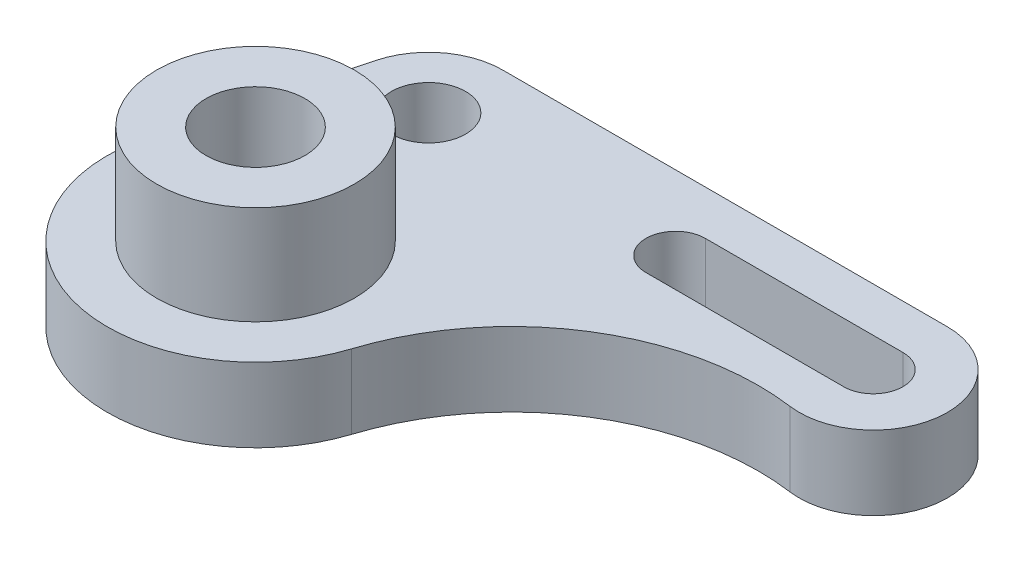
ISO-10303-21;
HEADER;
FILE_DESCRIPTION(('STEP AP214'),'2;1');
FILE_NAME('part.step','',(''),(''),'','','');
FILE_SCHEMA(('AUTOMOTIVE_DESIGN { 1 0 10303 214 1 1 1 1 }'));
ENDSEC;
DATA;
#1=APPLICATION_CONTEXT('core data for automotive mechanical design processes');
#2=APPLICATION_PROTOCOL_DEFINITION('international standard','automotive_design',2000,#1);
#3=PRODUCT_CONTEXT('',#1,'mechanical');
#4=PRODUCT('Part','Part','',(#3));
#5=PRODUCT_RELATED_PRODUCT_CATEGORY('part','',(#4));
#6=PRODUCT_DEFINITION_FORMATION('','',#4);
#7=PRODUCT_DEFINITION_CONTEXT('part definition',#1,'design');
#8=PRODUCT_DEFINITION('design','',#6,#7);
#9=PRODUCT_DEFINITION_SHAPE('','',#8);
#10=(LENGTH_UNIT() NAMED_UNIT(*) SI_UNIT(.MILLI.,.METRE.));
#11=(NAMED_UNIT(*) PLANE_ANGLE_UNIT() SI_UNIT($,.RADIAN.));
#12=(NAMED_UNIT(*) SI_UNIT($,.STERADIAN.) SOLID_ANGLE_UNIT());
#13=UNCERTAINTY_MEASURE_WITH_UNIT(LENGTH_MEASURE(1.E-05),#10,'distance_accuracy_value','');
#14=(GEOMETRIC_REPRESENTATION_CONTEXT(3) GLOBAL_UNCERTAINTY_ASSIGNED_CONTEXT((#13)) GLOBAL_UNIT_ASSIGNED_CONTEXT((#10,
#11,#12)) REPRESENTATION_CONTEXT('',''));
#15=CARTESIAN_POINT('',(0.,0.,0.));
#16=DIRECTION('',(0.,0.,1.));
#17=DIRECTION('',(1.,0.,0.));
#18=AXIS2_PLACEMENT_3D('',#15,#16,#17);
#19=CARTESIAN_POINT('',(-61.517336091964,15.,-16.1622196596945));
#20=DIRECTION('',(0.967177202898201,0.,0.254102849637724));
#21=DIRECTION('',(0.254102849637724,0.,-0.967177202898201));
#22=AXIS2_PLACEMENT_3D('',#19,#20,#21);
#23=PLANE('',#22);
#24=DIRECTION('',(-0.254102849637724,0.,0.967177202898201));
#25=VECTOR('',#24,1.);
#26=CARTESIAN_POINT('',(-61.517336091964,0.,-16.1622196596945));
#27=LINE('',#26,#25);
#28=CARTESIAN_POINT('',(-59.507658043473,0.,-23.8115427445659));
#29=VERTEX_POINT('',#28);
#30=CARTESIAN_POINT('',(-69.015316086946,0.,12.3769145108683));
#31=VERTEX_POINT('',#30);
#32=EDGE_CURVE('E173',#29,#31,#27,.T.);
#33=ORIENTED_EDGE('',*,*,#32,.T.);
#34=DIRECTION('',(0.,-1.,0.));
#35=VECTOR('',#34,1.);
#36=CARTESIAN_POINT('',(-69.015316086946,15.,12.3769145108683));
#37=LINE('',#36,#35);
#38=CARTESIAN_POINT('',(-69.015316086946,15.,12.3769145108683));
#39=VERTEX_POINT('',#38);
#40=EDGE_CURVE('E42',#39,#31,#37,.T.);
#41=ORIENTED_EDGE('',*,*,#40,.F.);
#42=DIRECTION('',(-0.254102849637724,0.,0.967177202898201));
#43=VECTOR('',#42,1.);
#44=CARTESIAN_POINT('',(-61.517336091964,15.,-16.1622196596945));
#45=LINE('',#44,#43);
#46=CARTESIAN_POINT('',(-59.507658043473,15.,-23.8115427445659));
#47=VERTEX_POINT('',#46);
#48=EDGE_CURVE('E176',#47,#39,#45,.T.);
#49=ORIENTED_EDGE('',*,*,#48,.F.);
#50=DIRECTION('',(0.,-1.,0.));
#51=VECTOR('',#50,1.);
#52=CARTESIAN_POINT('',(-59.507658043473,15.,-23.8115427445659));
#53=LINE('',#52,#51);
#54=EDGE_CURVE('E197',#47,#29,#53,.T.);
#55=ORIENTED_EDGE('',*,*,#54,.T.);
#56=EDGE_LOOP('',(#33,#41,#49,#55));
#57=FACE_BOUND('',#56,.T.);
#58=ADVANCED_FACE('F39',(#57),#23,.F.);
#59=CARTESIAN_POINT('',(-40.,15.,20.));
#60=DIRECTION('',(0.,-1.,0.));
#61=DIRECTION('',(0.,0.,-1.));
#62=AXIS2_PLACEMENT_3D('',#59,#60,#61);
#63=CYLINDRICAL_SURFACE('',#62,30.);
#64=CARTESIAN_POINT('',(-40.,0.,20.));
#65=DIRECTION('',(0.,1.,0.));
#66=DIRECTION('',(0.,0.,1.));
#67=AXIS2_PLACEMENT_3D('',#64,#65,#66);
#68=CIRCLE('',#67,30.);
#69=CARTESIAN_POINT('',(-11.429422304384,0.,29.149977603184));
#70=VERTEX_POINT('',#69);
#71=EDGE_CURVE('E201',#31,#70,#68,.T.);
#72=ORIENTED_EDGE('',*,*,#71,.T.);
#73=DIRECTION('',(0.,-1.,0.));
#74=VECTOR('',#73,1.);
#75=CARTESIAN_POINT('',(-11.429422304384,15.,29.149977603184));
#76=LINE('',#75,#74);
#77=CARTESIAN_POINT('',(-11.429422304384,15.,29.149977603184));
#78=VERTEX_POINT('',#77);
#79=EDGE_CURVE('E230',#78,#70,#76,.T.);
#80=ORIENTED_EDGE('',*,*,#79,.F.);
#81=CARTESIAN_POINT('',(-40.,15.,20.));
#82=DIRECTION('',(0.,1.,0.));
#83=DIRECTION('',(0.,0.,1.));
#84=AXIS2_PLACEMENT_3D('',#81,#82,#83);
#85=CIRCLE('',#84,30.);
#86=EDGE_CURVE('E180',#39,#78,#85,.T.);
#87=ORIENTED_EDGE('',*,*,#86,.F.);
#88=ORIENTED_EDGE('',*,*,#40,.T.);
#89=EDGE_LOOP('',(#72,#80,#87,#88));
#90=FACE_BOUND('',#89,.T.);
#91=ADVANCED_FACE('F241',(#90),#63,.T.);
#92=CARTESIAN_POINT('',(36.1882071883094,15.,44.3999402751574));
#93=DIRECTION('',(0.,-1.,0.));
#94=DIRECTION('',(0.,0.,-1.));
#95=AXIS2_PLACEMENT_3D('',#92,#93,#94);
#96=CYLINDRICAL_SURFACE('',#95,50.);
#97=CARTESIAN_POINT('',(36.1882071883094,0.,44.3999402751574));
#98=DIRECTION('',(0.,1.,0.));
#99=DIRECTION('',(0.,0.,1.));
#100=AXIS2_PLACEMENT_3D('',#97,#98,#99);
#101=CIRCLE('',#100,50.);
#102=CARTESIAN_POINT('',(42.9665093511483,0.,-5.13847532111752));
#103=VERTEX_POINT('',#102);
#104=EDGE_CURVE('E205',#103,#70,#101,.T.);
#105=ORIENTED_EDGE('',*,*,#104,.F.);
#106=DIRECTION('',(0.,-1.,0.));
#107=VECTOR('',#106,1.);
#108=CARTESIAN_POINT('',(42.9665093511483,15.,-5.13847532111752));
#109=LINE('',#108,#107);
#110=CARTESIAN_POINT('',(42.9665093511483,15.,-5.13847532111752));
#111=VERTEX_POINT('',#110);
#112=EDGE_CURVE('E228',#111,#103,#109,.T.);
#113=ORIENTED_EDGE('',*,*,#112,.F.);
#114=CARTESIAN_POINT('',(36.1882071883094,15.,44.3999402751574));
#115=DIRECTION('',(0.,1.,0.));
#116=DIRECTION('',(0.,0.,1.));
#117=AXIS2_PLACEMENT_3D('',#114,#115,#116);
#118=CIRCLE('',#117,50.);
#119=EDGE_CURVE('E184',#111,#78,#118,.T.);
#120=ORIENTED_EDGE('',*,*,#119,.T.);
#121=ORIENTED_EDGE('',*,*,#79,.T.);
#122=EDGE_LOOP('',(#105,#113,#120,#121));
#123=FACE_BOUND('',#122,.T.);
#124=ADVANCED_FACE('F249',(#123),#96,.F.);
#125=CARTESIAN_POINT('',(45.,15.,-20.));
#126=DIRECTION('',(0.,-1.,0.));
#127=DIRECTION('',(0.,0.,-1.));
#128=AXIS2_PLACEMENT_3D('',#125,#126,#127);
#129=CYLINDRICAL_SURFACE('',#128,15.);
#130=CARTESIAN_POINT('',(45.,0.,-20.));
#131=DIRECTION('',(0.,1.,0.));
#132=DIRECTION('',(0.,0.,1.));
#133=AXIS2_PLACEMENT_3D('',#130,#131,#132);
#134=CIRCLE('',#133,15.);
#135=CARTESIAN_POINT('',(45.,0.,-35.));
#136=VERTEX_POINT('',#135);
#137=EDGE_CURVE('E209',#103,#136,#134,.T.);
#138=ORIENTED_EDGE('',*,*,#137,.T.);
#139=DIRECTION('',(0.,-1.,0.));
#140=VECTOR('',#139,1.);
#141=CARTESIAN_POINT('',(45.,15.,-35.));
#142=LINE('',#141,#140);
#143=CARTESIAN_POINT('',(45.,15.,-35.));
#144=VERTEX_POINT('',#143);
#145=EDGE_CURVE('E224',#144,#136,#142,.T.);
#146=ORIENTED_EDGE('',*,*,#145,.F.);
#147=CARTESIAN_POINT('',(45.,15.,-20.));
#148=DIRECTION('',(0.,1.,0.));
#149=DIRECTION('',(0.,0.,1.));
#150=AXIS2_PLACEMENT_3D('',#147,#148,#149);
#151=CIRCLE('',#150,15.);
#152=EDGE_CURVE('E188',#111,#144,#151,.T.);
#153=ORIENTED_EDGE('',*,*,#152,.F.);
#154=ORIENTED_EDGE('',*,*,#112,.T.);
#155=EDGE_LOOP('',(#138,#146,#153,#154));
#156=FACE_BOUND('',#155,.T.);
#157=ADVANCED_FACE('F254',(#156),#129,.T.);
#158=CARTESIAN_POINT('',(0.,15.,-35.));
#159=DIRECTION('',(0.,0.,1.));
#160=DIRECTION('',(1.,0.,0.));
#161=AXIS2_PLACEMENT_3D('',#158,#159,#160);
#162=PLANE('',#161);
#163=DIRECTION('',(-1.,0.,0.));
#164=VECTOR('',#163,1.);
#165=CARTESIAN_POINT('',(0.,0.,-35.));
#166=LINE('',#165,#164);
#167=CARTESIAN_POINT('',(-45.,0.,-35.));
#168=VERTEX_POINT('',#167);
#169=EDGE_CURVE('E212',#136,#168,#166,.T.);
#170=ORIENTED_EDGE('',*,*,#169,.T.);
#171=DIRECTION('',(0.,-1.,0.));
#172=VECTOR('',#171,1.);
#173=CARTESIAN_POINT('',(-45.,15.,-35.));
#174=LINE('',#173,#172);
#175=CARTESIAN_POINT('',(-45.,15.,-35.));
#176=VERTEX_POINT('',#175);
#177=EDGE_CURVE('E220',#176,#168,#174,.T.);
#178=ORIENTED_EDGE('',*,*,#177,.F.);
#179=DIRECTION('',(-1.,0.,0.));
#180=VECTOR('',#179,1.);
#181=CARTESIAN_POINT('',(0.,15.,-35.));
#182=LINE('',#181,#180);
#183=EDGE_CURVE('E191',#144,#176,#182,.T.);
#184=ORIENTED_EDGE('',*,*,#183,.F.);
#185=ORIENTED_EDGE('',*,*,#145,.T.);
#186=EDGE_LOOP('',(#170,#178,#184,#185));
#187=FACE_BOUND('',#186,.T.);
#188=ADVANCED_FACE('F263',(#187),#162,.F.);
#189=CARTESIAN_POINT('',(-45.,15.,-20.));
#190=DIRECTION('',(0.,-1.,0.));
#191=DIRECTION('',(0.,0.,-1.));
#192=AXIS2_PLACEMENT_3D('',#189,#190,#191);
#193=CYLINDRICAL_SURFACE('',#192,15.);
#194=CARTESIAN_POINT('',(-45.,0.,-20.));
#195=DIRECTION('',(0.,1.,0.));
#196=DIRECTION('',(0.,0.,1.));
#197=AXIS2_PLACEMENT_3D('',#194,#195,#196);
#198=CIRCLE('',#197,15.);
#199=EDGE_CURVE('E181',#168,#29,#198,.T.);
#200=ORIENTED_EDGE('',*,*,#199,.T.);
#201=ORIENTED_EDGE('',*,*,#54,.F.);
#202=CARTESIAN_POINT('',(-45.,15.,-20.));
#203=DIRECTION('',(0.,1.,0.));
#204=DIRECTION('',(0.,0.,1.));
#205=AXIS2_PLACEMENT_3D('',#202,#203,#204);
#206=CIRCLE('',#205,15.);
#207=EDGE_CURVE('E194',#176,#47,#206,.T.);
#208=ORIENTED_EDGE('',*,*,#207,.F.);
#209=ORIENTED_EDGE('',*,*,#177,.T.);
#210=EDGE_LOOP('',(#200,#201,#208,#209));
#211=FACE_BOUND('',#210,.T.);
#212=ADVANCED_FACE('F261',(#211),#193,.T.);
#213=CARTESIAN_POINT('',(0.,15.,0.));
#214=DIRECTION('',(0.,1.,0.));
#215=DIRECTION('',(0.,0.,1.));
#216=AXIS2_PLACEMENT_3D('',#213,#214,#215);
#217=PLANE('',#216);
#218=CARTESIAN_POINT('',(-45.,15.,-20.));
#219=DIRECTION('',(0.,1.,0.));
#220=DIRECTION('',(0.,0.,1.));
#221=AXIS2_PLACEMENT_3D('',#218,#219,#220);
#222=CIRCLE('',#221,7.5);
#223=CARTESIAN_POINT('',(-45.,15.,-12.5));
#224=VERTEX_POINT('',#223);
#225=EDGE_CURVE('E146',#224,#224,#222,.T.);
#226=ORIENTED_EDGE('',*,*,#225,.F.);
#227=EDGE_LOOP('',(#226));
#228=FACE_BOUND('',#227,.T.);
#229=CARTESIAN_POINT('',(5.,15.,-20.));
#230=DIRECTION('',(0.,1.,0.));
#231=DIRECTION('',(0.,0.,1.));
#232=AXIS2_PLACEMENT_3D('',#229,#230,#231);
#233=CIRCLE('',#232,6.);
#234=CARTESIAN_POINT('',(5.,15.,-26.));
#235=VERTEX_POINT('',#234);
#236=CARTESIAN_POINT('',(5.,15.,-14.));
#237=VERTEX_POINT('',#236);
#238=EDGE_CURVE('E55',#235,#237,#233,.T.);
#239=ORIENTED_EDGE('',*,*,#238,.F.);
#240=DIRECTION('',(-1.,0.,0.));
#241=VECTOR('',#240,1.);
#242=CARTESIAN_POINT('',(5.,15.,-26.));
#243=LINE('',#242,#241);
#244=CARTESIAN_POINT('',(45.,15.,-26.));
#245=VERTEX_POINT('',#244);
#246=EDGE_CURVE('E138',#245,#235,#243,.T.);
#247=ORIENTED_EDGE('',*,*,#246,.F.);
#248=CARTESIAN_POINT('',(45.,15.,-20.));
#249=DIRECTION('',(0.,1.,0.));
#250=DIRECTION('',(0.,0.,1.));
#251=AXIS2_PLACEMENT_3D('',#248,#249,#250);
#252=CIRCLE('',#251,6.);
#253=CARTESIAN_POINT('',(45.,15.,-14.));
#254=VERTEX_POINT('',#253);
#255=EDGE_CURVE('E143',#254,#245,#252,.T.);
#256=ORIENTED_EDGE('',*,*,#255,.F.);
#257=DIRECTION('',(1.,0.,0.));
#258=VECTOR('',#257,1.);
#259=CARTESIAN_POINT('',(45.,15.,-14.));
#260=LINE('',#259,#258);
#261=EDGE_CURVE('E155',#237,#254,#260,.T.);
#262=ORIENTED_EDGE('',*,*,#261,.F.);
#263=EDGE_LOOP('',(#239,#247,#256,#262));
#264=FACE_BOUND('',#263,.T.);
#265=CARTESIAN_POINT('',(-40.,15.,20.));
#266=DIRECTION('',(0.,1.,0.));
#267=DIRECTION('',(0.,0.,1.));
#268=AXIS2_PLACEMENT_3D('',#265,#266,#267);
#269=CIRCLE('',#268,20.);
#270=CARTESIAN_POINT('',(-40.,15.,40.));
#271=VERTEX_POINT('',#270);
#272=EDGE_CURVE('E11',#271,#271,#269,.T.);
#273=ORIENTED_EDGE('',*,*,#272,.F.);
#274=EDGE_LOOP('',(#273));
#275=FACE_BOUND('',#274,.T.);
#276=ORIENTED_EDGE('',*,*,#48,.T.);
#277=ORIENTED_EDGE('',*,*,#86,.T.);
#278=ORIENTED_EDGE('',*,*,#119,.F.);
#279=ORIENTED_EDGE('',*,*,#152,.T.);
#280=ORIENTED_EDGE('',*,*,#183,.T.);
#281=ORIENTED_EDGE('',*,*,#207,.T.);
#282=EDGE_LOOP('',(#276,#277,#278,#279,#280,#281));
#283=FACE_BOUND('',#282,.T.);
#284=ADVANCED_FACE('F257',(#228,#264,#275,#283),#217,.T.);
#285=CARTESIAN_POINT('',(0.,0.,0.));
#286=DIRECTION('',(0.,1.,0.));
#287=DIRECTION('',(0.,0.,1.));
#288=AXIS2_PLACEMENT_3D('',#285,#286,#287);
#289=PLANE('',#288);
#290=CARTESIAN_POINT('',(-40.,0.,20.));
#291=DIRECTION('',(0.,1.,0.));
#292=DIRECTION('',(0.,0.,1.));
#293=AXIS2_PLACEMENT_3D('',#290,#291,#292);
#294=CIRCLE('',#293,10.);
#295=CARTESIAN_POINT('',(-40.,0.,30.));
#296=VERTEX_POINT('',#295);
#297=EDGE_CURVE('E156',#296,#296,#294,.T.);
#298=ORIENTED_EDGE('',*,*,#297,.T.);
#299=EDGE_LOOP('',(#298));
#300=FACE_BOUND('',#299,.T.);
#301=CARTESIAN_POINT('',(-45.,0.,-20.));
#302=DIRECTION('',(0.,1.,0.));
#303=DIRECTION('',(0.,0.,1.));
#304=AXIS2_PLACEMENT_3D('',#301,#302,#303);
#305=CIRCLE('',#304,7.5);
#306=CARTESIAN_POINT('',(-45.,0.,-12.5));
#307=VERTEX_POINT('',#306);
#308=EDGE_CURVE('E174',#307,#307,#305,.T.);
#309=ORIENTED_EDGE('',*,*,#308,.T.);
#310=EDGE_LOOP('',(#309));
#311=FACE_BOUND('',#310,.T.);
#312=DIRECTION('',(-1.,0.,0.));
#313=VECTOR('',#312,1.);
#314=CARTESIAN_POINT('',(5.,0.,-26.));
#315=LINE('',#314,#313);
#316=CARTESIAN_POINT('',(45.,0.,-26.));
#317=VERTEX_POINT('',#316);
#318=CARTESIAN_POINT('',(5.,0.,-26.));
#319=VERTEX_POINT('',#318);
#320=EDGE_CURVE('E126',#317,#319,#315,.T.);
#321=ORIENTED_EDGE('',*,*,#320,.T.);
#322=CARTESIAN_POINT('',(5.,0.,-20.));
#323=DIRECTION('',(0.,1.,0.));
#324=DIRECTION('',(0.,0.,1.));
#325=AXIS2_PLACEMENT_3D('',#322,#323,#324);
#326=CIRCLE('',#325,6.);
#327=CARTESIAN_POINT('',(5.,0.,-14.));
#328=VERTEX_POINT('',#327);
#329=EDGE_CURVE('E119',#319,#328,#326,.T.);
#330=ORIENTED_EDGE('',*,*,#329,.T.);
#331=DIRECTION('',(1.,0.,0.));
#332=VECTOR('',#331,1.);
#333=CARTESIAN_POINT('',(45.,0.,-14.));
#334=LINE('',#333,#332);
#335=CARTESIAN_POINT('',(45.,0.,-14.));
#336=VERTEX_POINT('',#335);
#337=EDGE_CURVE('E129',#328,#336,#334,.T.);
#338=ORIENTED_EDGE('',*,*,#337,.T.);
#339=CARTESIAN_POINT('',(45.,0.,-20.));
#340=DIRECTION('',(0.,1.,0.));
#341=DIRECTION('',(0.,0.,1.));
#342=AXIS2_PLACEMENT_3D('',#339,#340,#341);
#343=CIRCLE('',#342,6.);
#344=EDGE_CURVE('E63',#336,#317,#343,.T.);
#345=ORIENTED_EDGE('',*,*,#344,.T.);
#346=EDGE_LOOP('',(#321,#330,#338,#345));
#347=FACE_BOUND('',#346,.T.);
#348=ORIENTED_EDGE('',*,*,#32,.F.);
#349=ORIENTED_EDGE('',*,*,#199,.F.);
#350=ORIENTED_EDGE('',*,*,#169,.F.);
#351=ORIENTED_EDGE('',*,*,#137,.F.);
#352=ORIENTED_EDGE('',*,*,#104,.T.);
#353=ORIENTED_EDGE('',*,*,#71,.F.);
#354=EDGE_LOOP('',(#348,#349,#350,#351,#352,#353));
#355=FACE_BOUND('',#354,.T.);
#356=ADVANCED_FACE('F134',(#300,#311,#347,#355),#289,.F.);
#357=CARTESIAN_POINT('',(-40.,35.,20.));
#358=DIRECTION('',(0.,-1.,0.));
#359=DIRECTION('',(0.,0.,-1.));
#360=AXIS2_PLACEMENT_3D('',#357,#358,#359);
#361=CYLINDRICAL_SURFACE('',#360,20.);
#362=CARTESIAN_POINT('',(-40.,35.,20.));
#363=DIRECTION('',(0.,1.,0.));
#364=DIRECTION('',(0.,0.,1.));
#365=AXIS2_PLACEMENT_3D('',#362,#363,#364);
#366=CIRCLE('',#365,20.);
#367=CARTESIAN_POINT('',(-40.,35.,40.));
#368=VERTEX_POINT('',#367);
#369=EDGE_CURVE('E170',#368,#368,#366,.T.);
#370=ORIENTED_EDGE('',*,*,#369,.F.);
#371=EDGE_LOOP('',(#370));
#372=FACE_BOUND('',#371,.T.);
#373=ORIENTED_EDGE('',*,*,#272,.T.);
#374=EDGE_LOOP('',(#373));
#375=FACE_BOUND('',#374,.T.);
#376=ADVANCED_FACE('F316',(#372,#375),#361,.T.);
#377=CARTESIAN_POINT('',(-40.,35.,20.));
#378=DIRECTION('',(0.,1.,0.));
#379=DIRECTION('',(0.,0.,1.));
#380=AXIS2_PLACEMENT_3D('',#377,#378,#379);
#381=PLANE('',#380);
#382=CARTESIAN_POINT('',(-40.,35.,20.));
#383=DIRECTION('',(0.,1.,0.));
#384=DIRECTION('',(0.,0.,1.));
#385=AXIS2_PLACEMENT_3D('',#382,#383,#384);
#386=CIRCLE('',#385,10.);
#387=CARTESIAN_POINT('',(-40.,35.,30.));
#388=VERTEX_POINT('',#387);
#389=EDGE_CURVE('E440',#388,#388,#386,.T.);
#390=ORIENTED_EDGE('',*,*,#389,.F.);
#391=EDGE_LOOP('',(#390));
#392=FACE_BOUND('',#391,.T.);
#393=ORIENTED_EDGE('',*,*,#369,.T.);
#394=EDGE_LOOP('',(#393));
#395=FACE_BOUND('',#394,.T.);
#396=ADVANCED_FACE('F327',(#392,#395),#381,.T.);
#397=CARTESIAN_POINT('',(5.,0.,-20.));
#398=DIRECTION('',(0.,1.,0.));
#399=DIRECTION('',(0.,0.,1.));
#400=AXIS2_PLACEMENT_3D('',#397,#398,#399);
#401=CYLINDRICAL_SURFACE('',#400,6.);
#402=ORIENTED_EDGE('',*,*,#238,.T.);
#403=DIRECTION('',(0.,1.,0.));
#404=VECTOR('',#403,1.);
#405=CARTESIAN_POINT('',(5.,0.,-14.));
#406=LINE('',#405,#404);
#407=EDGE_CURVE('E115',#328,#237,#406,.T.);
#408=ORIENTED_EDGE('',*,*,#407,.F.);
#409=ORIENTED_EDGE('',*,*,#329,.F.);
#410=DIRECTION('',(0.,1.,0.));
#411=VECTOR('',#410,1.);
#412=CARTESIAN_POINT('',(5.,0.,-26.));
#413=LINE('',#412,#411);
#414=EDGE_CURVE('E162',#319,#235,#413,.T.);
#415=ORIENTED_EDGE('',*,*,#414,.T.);
#416=EDGE_LOOP('',(#402,#408,#409,#415));
#417=FACE_BOUND('',#416,.T.);
#418=ADVANCED_FACE('F117',(#417),#401,.F.);
#419=CARTESIAN_POINT('',(5.,0.,-26.));
#420=DIRECTION('',(0.,0.,-1.));
#421=DIRECTION('',(-1.,0.,0.));
#422=AXIS2_PLACEMENT_3D('',#419,#420,#421);
#423=PLANE('',#422);
#424=ORIENTED_EDGE('',*,*,#246,.T.);
#425=ORIENTED_EDGE('',*,*,#414,.F.);
#426=ORIENTED_EDGE('',*,*,#320,.F.);
#427=DIRECTION('',(0.,1.,0.));
#428=VECTOR('',#427,1.);
#429=CARTESIAN_POINT('',(45.,0.,-26.));
#430=LINE('',#429,#428);
#431=EDGE_CURVE('E165',#317,#245,#430,.T.);
#432=ORIENTED_EDGE('',*,*,#431,.T.);
#433=EDGE_LOOP('',(#424,#425,#426,#432));
#434=FACE_BOUND('',#433,.T.);
#435=ADVANCED_FACE('F345',(#434),#423,.F.);
#436=CARTESIAN_POINT('',(45.,0.,-20.));
#437=DIRECTION('',(0.,1.,0.));
#438=DIRECTION('',(0.,0.,1.));
#439=AXIS2_PLACEMENT_3D('',#436,#437,#438);
#440=CYLINDRICAL_SURFACE('',#439,6.);
#441=ORIENTED_EDGE('',*,*,#255,.T.);
#442=ORIENTED_EDGE('',*,*,#431,.F.);
#443=ORIENTED_EDGE('',*,*,#344,.F.);
#444=DIRECTION('',(0.,1.,0.));
#445=VECTOR('',#444,1.);
#446=CARTESIAN_POINT('',(45.,0.,-14.));
#447=LINE('',#446,#445);
#448=EDGE_CURVE('E125',#336,#254,#447,.T.);
#449=ORIENTED_EDGE('',*,*,#448,.T.);
#450=EDGE_LOOP('',(#441,#442,#443,#449));
#451=FACE_BOUND('',#450,.T.);
#452=ADVANCED_FACE('F354',(#451),#440,.F.);
#453=CARTESIAN_POINT('',(45.,0.,-14.));
#454=DIRECTION('',(0.,0.,1.));
#455=DIRECTION('',(1.,0.,0.));
#456=AXIS2_PLACEMENT_3D('',#453,#454,#455);
#457=PLANE('',#456);
#458=ORIENTED_EDGE('',*,*,#261,.T.);
#459=ORIENTED_EDGE('',*,*,#448,.F.);
#460=ORIENTED_EDGE('',*,*,#337,.F.);
#461=ORIENTED_EDGE('',*,*,#407,.T.);
#462=EDGE_LOOP('',(#458,#459,#460,#461));
#463=FACE_BOUND('',#462,.T.);
#464=ADVANCED_FACE('F130',(#463),#457,.F.);
#465=CARTESIAN_POINT('',(-45.,0.,-20.));
#466=DIRECTION('',(0.,1.,0.));
#467=DIRECTION('',(0.,0.,1.));
#468=AXIS2_PLACEMENT_3D('',#465,#466,#467);
#469=CYLINDRICAL_SURFACE('',#468,7.5);
#470=ORIENTED_EDGE('',*,*,#308,.F.);
#471=EDGE_LOOP('',(#470));
#472=FACE_BOUND('',#471,.T.);
#473=ORIENTED_EDGE('',*,*,#225,.T.);
#474=EDGE_LOOP('',(#473));
#475=FACE_BOUND('',#474,.T.);
#476=ADVANCED_FACE('F372',(#472,#475),#469,.F.);
#477=CARTESIAN_POINT('',(-40.,0.,20.));
#478=DIRECTION('',(0.,1.,0.));
#479=DIRECTION('',(0.,0.,1.));
#480=AXIS2_PLACEMENT_3D('',#477,#478,#479);
#481=CYLINDRICAL_SURFACE('',#480,10.);
#482=ORIENTED_EDGE('',*,*,#297,.F.);
#483=EDGE_LOOP('',(#482));
#484=FACE_BOUND('',#483,.T.);
#485=ORIENTED_EDGE('',*,*,#389,.T.);
#486=EDGE_LOOP('',(#485));
#487=FACE_BOUND('',#486,.T.);
#488=ADVANCED_FACE('F380',(#484,#487),#481,.F.);
#489=CLOSED_SHELL('',(#58,#91,#124,#157,#188,#212,#284,#356,#376,#396,#418,#435,#452,#464,#476,#488));
#490=MANIFOLD_SOLID_BREP('B2',#489);
#491=ADVANCED_BREP_SHAPE_REPRESENTATION('',(#18,#490),#14);
#492=SHAPE_DEFINITION_REPRESENTATION(#9,#491);
ENDSEC;
END-ISO-10303-21;
